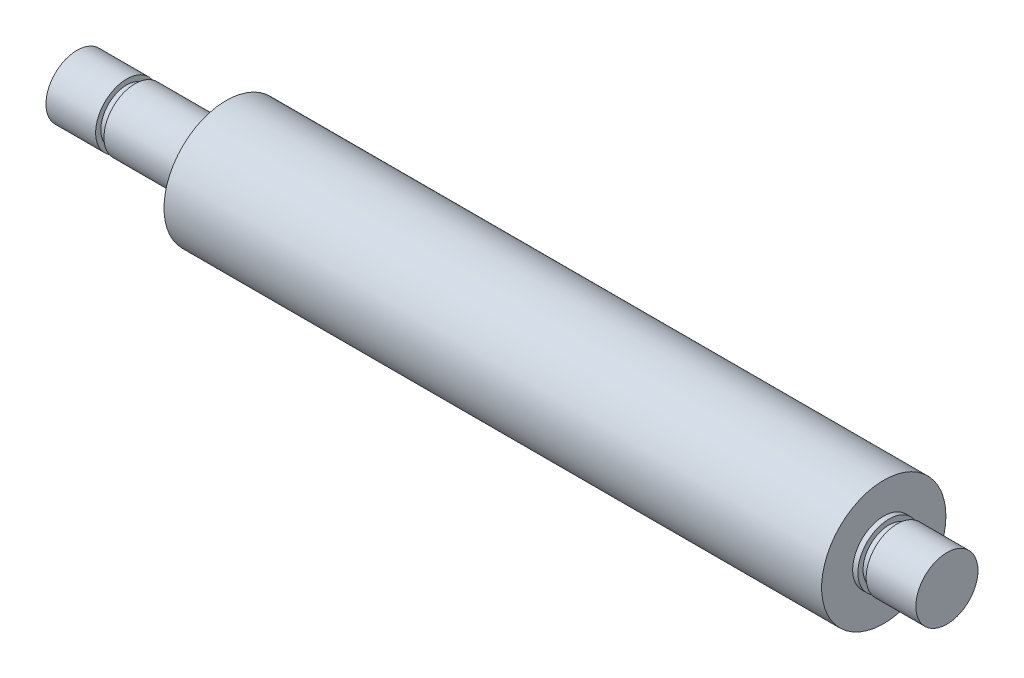
ISO-10303-21;
HEADER;
FILE_DESCRIPTION(('STEP AP214'),'2;1');
FILE_NAME('part.step','',(''),(''),'','','');
FILE_SCHEMA(('AUTOMOTIVE_DESIGN { 1 0 10303 214 1 1 1 1 }'));
ENDSEC;
DATA;
#1=APPLICATION_CONTEXT('core data for automotive mechanical design processes');
#2=APPLICATION_PROTOCOL_DEFINITION('international standard','automotive_design',2000,#1);
#3=PRODUCT_CONTEXT('',#1,'mechanical');
#4=PRODUCT('Part','Part','',(#3));
#5=PRODUCT_RELATED_PRODUCT_CATEGORY('part','',(#4));
#6=PRODUCT_DEFINITION_FORMATION('','',#4);
#7=PRODUCT_DEFINITION_CONTEXT('part definition',#1,'design');
#8=PRODUCT_DEFINITION('design','',#6,#7);
#9=PRODUCT_DEFINITION_SHAPE('','',#8);
#10=(LENGTH_UNIT() NAMED_UNIT(*) SI_UNIT(.MILLI.,.METRE.));
#11=(NAMED_UNIT(*) PLANE_ANGLE_UNIT() SI_UNIT($,.RADIAN.));
#12=(NAMED_UNIT(*) SI_UNIT($,.STERADIAN.) SOLID_ANGLE_UNIT());
#13=UNCERTAINTY_MEASURE_WITH_UNIT(LENGTH_MEASURE(1.E-05),#10,'distance_accuracy_value','');
#14=(GEOMETRIC_REPRESENTATION_CONTEXT(3) GLOBAL_UNCERTAINTY_ASSIGNED_CONTEXT((#13)) GLOBAL_UNIT_ASSIGNED_CONTEXT((#10,
#11,#12)) REPRESENTATION_CONTEXT('',''));
#15=CARTESIAN_POINT('',(0.,0.,0.));
#16=DIRECTION('',(0.,0.,1.));
#17=DIRECTION('',(1.,0.,0.));
#18=AXIS2_PLACEMENT_3D('',#15,#16,#17);
#19=CARTESIAN_POINT('',(-42.,0.,0.));
#20=DIRECTION('',(1.,0.,0.));
#21=DIRECTION('',(0.,0.,-1.));
#22=AXIS2_PLACEMENT_3D('',#19,#20,#21);
#23=CYLINDRICAL_SURFACE('',#22,3.);
#24=CARTESIAN_POINT('',(-42.,0.,0.));
#25=DIRECTION('',(1.,0.,0.));
#26=DIRECTION('',(0.,0.,-1.));
#27=AXIS2_PLACEMENT_3D('',#24,#25,#26);
#28=CIRCLE('',#27,3.);
#29=CARTESIAN_POINT('',(-42.,0.,-3.));
#30=VERTEX_POINT('',#29);
#31=EDGE_CURVE('E10',#30,#30,#28,.T.);
#32=ORIENTED_EDGE('',*,*,#31,.T.);
#33=EDGE_LOOP('',(#32));
#34=FACE_BOUND('',#33,.T.);
#35=CARTESIAN_POINT('',(-37.2,0.,0.));
#36=DIRECTION('',(1.,0.,0.));
#37=DIRECTION('',(0.,0.,-1.));
#38=AXIS2_PLACEMENT_3D('',#35,#36,#37);
#39=CIRCLE('',#38,3.);
#40=CARTESIAN_POINT('',(-37.2,0.,-3.));
#41=VERTEX_POINT('',#40);
#42=EDGE_CURVE('E78',#41,#41,#39,.T.);
#43=ORIENTED_EDGE('',*,*,#42,.F.);
#44=EDGE_LOOP('',(#43));
#45=FACE_BOUND('',#44,.T.);
#46=ADVANCED_FACE('F32',(#34,#45),#23,.T.);
#47=CARTESIAN_POINT('',(-42.,3.,0.));
#48=DIRECTION('',(-1.,0.,0.));
#49=DIRECTION('',(0.,0.,1.));
#50=AXIS2_PLACEMENT_3D('',#47,#48,#49);
#51=PLANE('',#50);
#52=ORIENTED_EDGE('',*,*,#31,.F.);
#53=EDGE_LOOP('',(#52));
#54=FACE_BOUND('',#53,.T.);
#55=ADVANCED_FACE('F86',(#54),#51,.T.);
#56=CARTESIAN_POINT('',(42.,0.,0.));
#57=DIRECTION('',(1.,0.,0.));
#58=DIRECTION('',(0.,0.,-1.));
#59=AXIS2_PLACEMENT_3D('',#56,#57,#58);
#60=PLANE('',#59);
#61=CARTESIAN_POINT('',(42.,0.,0.));
#62=DIRECTION('',(1.,0.,0.));
#63=DIRECTION('',(0.,0.,-1.));
#64=AXIS2_PLACEMENT_3D('',#61,#62,#63);
#65=CIRCLE('',#64,3.);
#66=CARTESIAN_POINT('',(42.,0.,-3.));
#67=VERTEX_POINT('',#66);
#68=EDGE_CURVE('E38',#67,#67,#65,.T.);
#69=ORIENTED_EDGE('',*,*,#68,.T.);
#70=EDGE_LOOP('',(#69));
#71=FACE_BOUND('',#70,.T.);
#72=ADVANCED_FACE('F90',(#71),#60,.T.);
#73=CARTESIAN_POINT('',(-42.,0.,0.));
#74=DIRECTION('',(1.,0.,0.));
#75=DIRECTION('',(0.,0.,-1.));
#76=AXIS2_PLACEMENT_3D('',#73,#74,#75);
#77=CYLINDRICAL_SURFACE('',#76,3.);
#78=CARTESIAN_POINT('',(37.2,0.,0.));
#79=DIRECTION('',(1.,0.,0.));
#80=DIRECTION('',(0.,0.,-1.));
#81=AXIS2_PLACEMENT_3D('',#78,#79,#80);
#82=CIRCLE('',#81,3.);
#83=CARTESIAN_POINT('',(37.2,0.,-3.));
#84=VERTEX_POINT('',#83);
#85=EDGE_CURVE('E42',#84,#84,#82,.T.);
#86=ORIENTED_EDGE('',*,*,#85,.T.);
#87=EDGE_LOOP('',(#86));
#88=FACE_BOUND('',#87,.T.);
#89=ORIENTED_EDGE('',*,*,#68,.F.);
#90=EDGE_LOOP('',(#89));
#91=FACE_BOUND('',#90,.T.);
#92=ADVANCED_FACE('F95',(#88,#91),#77,.T.);
#93=CARTESIAN_POINT('',(37.2,3.,0.));
#94=DIRECTION('',(-1.,0.,0.));
#95=DIRECTION('',(0.,0.,1.));
#96=AXIS2_PLACEMENT_3D('',#93,#94,#95);
#97=PLANE('',#96);
#98=CARTESIAN_POINT('',(37.2,0.,0.));
#99=DIRECTION('',(1.,0.,0.));
#100=DIRECTION('',(0.,0.,-1.));
#101=AXIS2_PLACEMENT_3D('',#98,#99,#100);
#102=CIRCLE('',#101,2.5);
#103=CARTESIAN_POINT('',(37.2,0.,-2.5));
#104=VERTEX_POINT('',#103);
#105=EDGE_CURVE('E46',#104,#104,#102,.T.);
#106=ORIENTED_EDGE('',*,*,#105,.T.);
#107=EDGE_LOOP('',(#106));
#108=FACE_BOUND('',#107,.T.);
#109=ORIENTED_EDGE('',*,*,#85,.F.);
#110=EDGE_LOOP('',(#109));
#111=FACE_BOUND('',#110,.T.);
#112=ADVANCED_FACE('F100',(#108,#111),#97,.T.);
#113=CARTESIAN_POINT('',(-42.,0.,0.));
#114=DIRECTION('',(1.,0.,0.));
#115=DIRECTION('',(0.,0.,-1.));
#116=AXIS2_PLACEMENT_3D('',#113,#114,#115);
#117=CYLINDRICAL_SURFACE('',#116,2.5);
#118=CARTESIAN_POINT('',(36.4,0.,0.));
#119=DIRECTION('',(1.,0.,0.));
#120=DIRECTION('',(0.,0.,-1.));
#121=AXIS2_PLACEMENT_3D('',#118,#119,#120);
#122=CIRCLE('',#121,2.5);
#123=CARTESIAN_POINT('',(36.4,0.,-2.5));
#124=VERTEX_POINT('',#123);
#125=EDGE_CURVE('E51',#124,#124,#122,.T.);
#126=ORIENTED_EDGE('',*,*,#125,.T.);
#127=EDGE_LOOP('',(#126));
#128=FACE_BOUND('',#127,.T.);
#129=ORIENTED_EDGE('',*,*,#105,.F.);
#130=EDGE_LOOP('',(#129));
#131=FACE_BOUND('',#130,.T.);
#132=ADVANCED_FACE('F104',(#128,#131),#117,.T.);
#133=CARTESIAN_POINT('',(36.4,2.5,0.));
#134=DIRECTION('',(1.,0.,0.));
#135=DIRECTION('',(0.,0.,-1.));
#136=AXIS2_PLACEMENT_3D('',#133,#134,#135);
#137=PLANE('',#136);
#138=CARTESIAN_POINT('',(36.4,0.,0.));
#139=DIRECTION('',(1.,0.,0.));
#140=DIRECTION('',(0.,0.,-1.));
#141=AXIS2_PLACEMENT_3D('',#138,#139,#140);
#142=CIRCLE('',#141,3.);
#143=CARTESIAN_POINT('',(36.4,0.,-3.));
#144=VERTEX_POINT('',#143);
#145=EDGE_CURVE('E54',#144,#144,#142,.T.);
#146=ORIENTED_EDGE('',*,*,#145,.T.);
#147=EDGE_LOOP('',(#146));
#148=FACE_BOUND('',#147,.T.);
#149=ORIENTED_EDGE('',*,*,#125,.F.);
#150=EDGE_LOOP('',(#149));
#151=FACE_BOUND('',#150,.T.);
#152=ADVANCED_FACE('F108',(#148,#151),#137,.T.);
#153=CARTESIAN_POINT('',(-42.,0.,0.));
#154=DIRECTION('',(1.,0.,0.));
#155=DIRECTION('',(0.,0.,-1.));
#156=AXIS2_PLACEMENT_3D('',#153,#154,#155);
#157=CYLINDRICAL_SURFACE('',#156,3.);
#158=CARTESIAN_POINT('',(35.9,0.,0.));
#159=DIRECTION('',(1.,0.,0.));
#160=DIRECTION('',(0.,0.,-1.));
#161=AXIS2_PLACEMENT_3D('',#158,#159,#160);
#162=CIRCLE('',#161,3.);
#163=CARTESIAN_POINT('',(35.9,0.,-3.));
#164=VERTEX_POINT('',#163);
#165=EDGE_CURVE('E57',#164,#164,#162,.T.);
#166=ORIENTED_EDGE('',*,*,#165,.T.);
#167=EDGE_LOOP('',(#166));
#168=FACE_BOUND('',#167,.T.);
#169=ORIENTED_EDGE('',*,*,#145,.F.);
#170=EDGE_LOOP('',(#169));
#171=FACE_BOUND('',#170,.T.);
#172=ADVANCED_FACE('F112',(#168,#171),#157,.T.);
#173=CARTESIAN_POINT('',(35.9,3.,0.));
#174=DIRECTION('',(1.,0.,0.));
#175=DIRECTION('',(0.,0.,-1.));
#176=AXIS2_PLACEMENT_3D('',#173,#174,#175);
#177=PLANE('',#176);
#178=CARTESIAN_POINT('',(35.9,0.,0.));
#179=DIRECTION('',(1.,0.,0.));
#180=DIRECTION('',(0.,0.,-1.));
#181=AXIS2_PLACEMENT_3D('',#178,#179,#180);
#182=CIRCLE('',#181,6.);
#183=CARTESIAN_POINT('',(35.9,0.,-6.));
#184=VERTEX_POINT('',#183);
#185=EDGE_CURVE('E60',#184,#184,#182,.T.);
#186=ORIENTED_EDGE('',*,*,#185,.T.);
#187=EDGE_LOOP('',(#186));
#188=FACE_BOUND('',#187,.T.);
#189=ORIENTED_EDGE('',*,*,#165,.F.);
#190=EDGE_LOOP('',(#189));
#191=FACE_BOUND('',#190,.T.);
#192=ADVANCED_FACE('F116',(#188,#191),#177,.T.);
#193=CARTESIAN_POINT('',(-42.,0.,0.));
#194=DIRECTION('',(1.,0.,0.));
#195=DIRECTION('',(0.,0.,-1.));
#196=AXIS2_PLACEMENT_3D('',#193,#194,#195);
#197=CYLINDRICAL_SURFACE('',#196,6.);
#198=CARTESIAN_POINT('',(-27.6,0.,0.));
#199=DIRECTION('',(1.,0.,0.));
#200=DIRECTION('',(0.,0.,-1.));
#201=AXIS2_PLACEMENT_3D('',#198,#199,#200);
#202=CIRCLE('',#201,6.);
#203=CARTESIAN_POINT('',(-27.6,0.,-6.));
#204=VERTEX_POINT('',#203);
#205=EDGE_CURVE('E63',#204,#204,#202,.T.);
#206=ORIENTED_EDGE('',*,*,#205,.T.);
#207=EDGE_LOOP('',(#206));
#208=FACE_BOUND('',#207,.T.);
#209=ORIENTED_EDGE('',*,*,#185,.F.);
#210=EDGE_LOOP('',(#209));
#211=FACE_BOUND('',#210,.T.);
#212=ADVANCED_FACE('F120',(#208,#211),#197,.T.);
#213=CARTESIAN_POINT('',(-27.6,6.,0.));
#214=DIRECTION('',(-1.,0.,0.));
#215=DIRECTION('',(0.,0.,1.));
#216=AXIS2_PLACEMENT_3D('',#213,#214,#215);
#217=PLANE('',#216);
#218=CARTESIAN_POINT('',(-27.6,0.,0.));
#219=DIRECTION('',(1.,0.,0.));
#220=DIRECTION('',(0.,0.,-1.));
#221=AXIS2_PLACEMENT_3D('',#218,#219,#220);
#222=CIRCLE('',#221,3.);
#223=CARTESIAN_POINT('',(-27.6,0.,-3.));
#224=VERTEX_POINT('',#223);
#225=EDGE_CURVE('E66',#224,#224,#222,.T.);
#226=ORIENTED_EDGE('',*,*,#225,.T.);
#227=EDGE_LOOP('',(#226));
#228=FACE_BOUND('',#227,.T.);
#229=ORIENTED_EDGE('',*,*,#205,.F.);
#230=EDGE_LOOP('',(#229));
#231=FACE_BOUND('',#230,.T.);
#232=ADVANCED_FACE('F124',(#228,#231),#217,.T.);
#233=CARTESIAN_POINT('',(-42.,0.,0.));
#234=DIRECTION('',(1.,0.,0.));
#235=DIRECTION('',(0.,0.,-1.));
#236=AXIS2_PLACEMENT_3D('',#233,#234,#235);
#237=CYLINDRICAL_SURFACE('',#236,3.);
#238=CARTESIAN_POINT('',(-36.4,0.,0.));
#239=DIRECTION('',(1.,0.,0.));
#240=DIRECTION('',(0.,0.,-1.));
#241=AXIS2_PLACEMENT_3D('',#238,#239,#240);
#242=CIRCLE('',#241,3.);
#243=CARTESIAN_POINT('',(-36.4,0.,-3.));
#244=VERTEX_POINT('',#243);
#245=EDGE_CURVE('E69',#244,#244,#242,.T.);
#246=ORIENTED_EDGE('',*,*,#245,.T.);
#247=EDGE_LOOP('',(#246));
#248=FACE_BOUND('',#247,.T.);
#249=ORIENTED_EDGE('',*,*,#225,.F.);
#250=EDGE_LOOP('',(#249));
#251=FACE_BOUND('',#250,.T.);
#252=ADVANCED_FACE('F128',(#248,#251),#237,.T.);
#253=CARTESIAN_POINT('',(-36.4,3.,0.));
#254=DIRECTION('',(-1.,0.,0.));
#255=DIRECTION('',(0.,0.,1.));
#256=AXIS2_PLACEMENT_3D('',#253,#254,#255);
#257=PLANE('',#256);
#258=CARTESIAN_POINT('',(-36.4,0.,0.));
#259=DIRECTION('',(1.,0.,0.));
#260=DIRECTION('',(0.,0.,-1.));
#261=AXIS2_PLACEMENT_3D('',#258,#259,#260);
#262=CIRCLE('',#261,2.5);
#263=CARTESIAN_POINT('',(-36.4,0.,-2.5));
#264=VERTEX_POINT('',#263);
#265=EDGE_CURVE('E72',#264,#264,#262,.T.);
#266=ORIENTED_EDGE('',*,*,#265,.T.);
#267=EDGE_LOOP('',(#266));
#268=FACE_BOUND('',#267,.T.);
#269=ORIENTED_EDGE('',*,*,#245,.F.);
#270=EDGE_LOOP('',(#269));
#271=FACE_BOUND('',#270,.T.);
#272=ADVANCED_FACE('F132',(#268,#271),#257,.T.);
#273=CARTESIAN_POINT('',(-42.,0.,0.));
#274=DIRECTION('',(1.,0.,0.));
#275=DIRECTION('',(0.,0.,-1.));
#276=AXIS2_PLACEMENT_3D('',#273,#274,#275);
#277=CYLINDRICAL_SURFACE('',#276,2.5);
#278=CARTESIAN_POINT('',(-37.2,0.,0.));
#279=DIRECTION('',(1.,0.,0.));
#280=DIRECTION('',(0.,0.,-1.));
#281=AXIS2_PLACEMENT_3D('',#278,#279,#280);
#282=CIRCLE('',#281,2.5);
#283=CARTESIAN_POINT('',(-37.2,0.,-2.5));
#284=VERTEX_POINT('',#283);
#285=EDGE_CURVE('E75',#284,#284,#282,.T.);
#286=ORIENTED_EDGE('',*,*,#285,.T.);
#287=EDGE_LOOP('',(#286));
#288=FACE_BOUND('',#287,.T.);
#289=ORIENTED_EDGE('',*,*,#265,.F.);
#290=EDGE_LOOP('',(#289));
#291=FACE_BOUND('',#290,.T.);
#292=ADVANCED_FACE('F136',(#288,#291),#277,.T.);
#293=CARTESIAN_POINT('',(-37.2,2.5,0.));
#294=DIRECTION('',(1.,0.,0.));
#295=DIRECTION('',(0.,0.,-1.));
#296=AXIS2_PLACEMENT_3D('',#293,#294,#295);
#297=PLANE('',#296);
#298=ORIENTED_EDGE('',*,*,#42,.T.);
#299=EDGE_LOOP('',(#298));
#300=FACE_BOUND('',#299,.T.);
#301=ORIENTED_EDGE('',*,*,#285,.F.);
#302=EDGE_LOOP('',(#301));
#303=FACE_BOUND('',#302,.T.);
#304=ADVANCED_FACE('F82',(#300,#303),#297,.T.);
#305=CLOSED_SHELL('',(#46,#55,#72,#92,#112,#132,#152,#172,#192,#212,#232,#252,#272,#292,#304));
#306=MANIFOLD_SOLID_BREP('B2',#305);
#307=ADVANCED_BREP_SHAPE_REPRESENTATION('',(#18,#306),#14);
#308=SHAPE_DEFINITION_REPRESENTATION(#9,#307);
ENDSEC;
END-ISO-10303-21;
